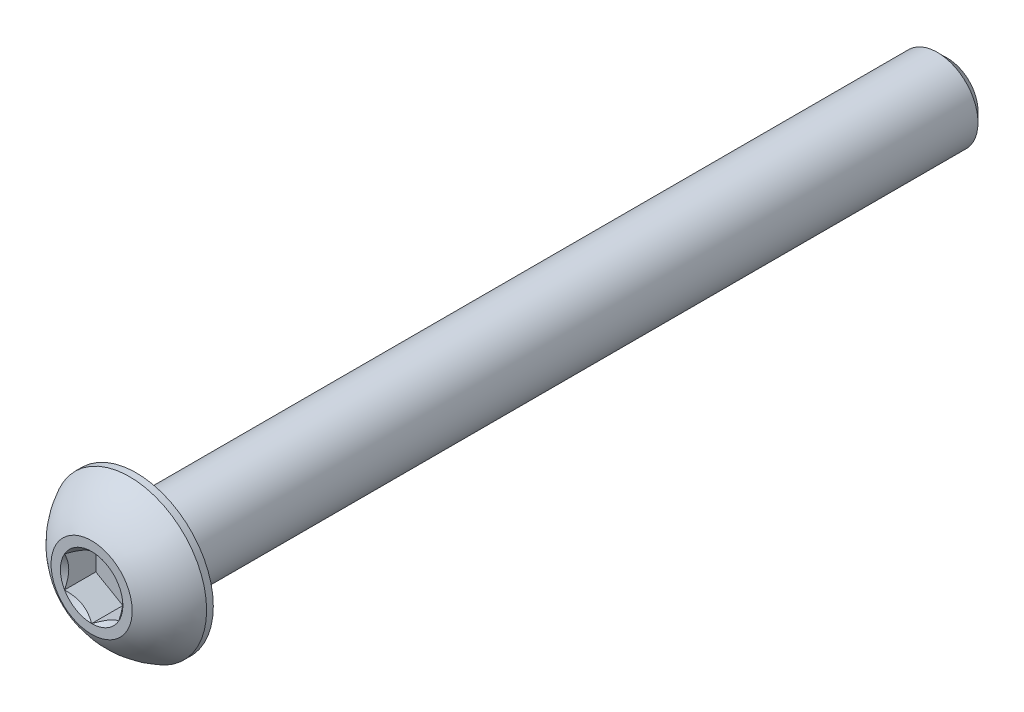
ISO-10303-21;
HEADER;
FILE_DESCRIPTION(('STEP AP214'),'2;1');
FILE_NAME('part.step','',(''),(''),'','','');
FILE_SCHEMA(('AUTOMOTIVE_DESIGN { 1 0 10303 214 1 1 1 1 }'));
ENDSEC;
DATA;
#1=APPLICATION_CONTEXT('core data for automotive mechanical design processes');
#2=APPLICATION_PROTOCOL_DEFINITION('international standard','automotive_design',2000,#1);
#3=PRODUCT_CONTEXT('',#1,'mechanical');
#4=PRODUCT('Part','Part','',(#3));
#5=PRODUCT_RELATED_PRODUCT_CATEGORY('part','',(#4));
#6=PRODUCT_DEFINITION_FORMATION('','',#4);
#7=PRODUCT_DEFINITION_CONTEXT('part definition',#1,'design');
#8=PRODUCT_DEFINITION('design','',#6,#7);
#9=PRODUCT_DEFINITION_SHAPE('','',#8);
#10=(LENGTH_UNIT() NAMED_UNIT(*) SI_UNIT(.MILLI.,.METRE.));
#11=(NAMED_UNIT(*) PLANE_ANGLE_UNIT() SI_UNIT($,.RADIAN.));
#12=(NAMED_UNIT(*) SI_UNIT($,.STERADIAN.) SOLID_ANGLE_UNIT());
#13=UNCERTAINTY_MEASURE_WITH_UNIT(LENGTH_MEASURE(1.E-05),#10,'distance_accuracy_value','');
#14=(GEOMETRIC_REPRESENTATION_CONTEXT(3) GLOBAL_UNCERTAINTY_ASSIGNED_CONTEXT((#13)) GLOBAL_UNIT_ASSIGNED_CONTEXT((#10,
#11,#12)) REPRESENTATION_CONTEXT('',''));
#15=CARTESIAN_POINT('',(0.,0.,0.));
#16=DIRECTION('',(0.,0.,1.));
#17=DIRECTION('',(1.,0.,0.));
#18=AXIS2_PLACEMENT_3D('',#15,#16,#17);
#19=CARTESIAN_POINT('',(0.,0.,-31.65));
#20=DIRECTION('',(0.,0.,1.));
#21=DIRECTION('',(1.,0.,0.));
#22=AXIS2_PLACEMENT_3D('',#19,#20,#21);
#23=PLANE('',#22);
#24=CARTESIAN_POINT('',(0.,0.,-31.65));
#25=DIRECTION('',(0.,0.,1.));
#26=DIRECTION('',(1.,0.,0.));
#27=AXIS2_PLACEMENT_3D('',#24,#25,#26);
#28=CIRCLE('',#27,1.12500000000003);
#29=CARTESIAN_POINT('',(1.12500000000003,0.,-31.65));
#30=VERTEX_POINT('',#29);
#31=EDGE_CURVE('E49',#30,#30,#28,.T.);
#32=ORIENTED_EDGE('',*,*,#31,.F.);
#33=EDGE_LOOP('',(#32));
#34=FACE_BOUND('',#33,.T.);
#35=ADVANCED_FACE('F36',(#34),#23,.F.);
#36=CARTESIAN_POINT('',(0.,0.,-31.65));
#37=DIRECTION('',(0.,0.,1.));
#38=DIRECTION('',(1.,0.,0.));
#39=AXIS2_PLACEMENT_3D('',#36,#37,#38);
#40=CONICAL_SURFACE('',#39,1.12500000000003,0.78539816339743);
#41=CARTESIAN_POINT('',(0.,0.,-31.275));
#42=DIRECTION('',(0.,0.,1.));
#43=DIRECTION('',(1.,0.,0.));
#44=AXIS2_PLACEMENT_3D('',#41,#42,#43);
#45=CIRCLE('',#44,1.50000000000001);
#46=CARTESIAN_POINT('',(1.50000000000001,0.,-31.275));
#47=VERTEX_POINT('',#46);
#48=EDGE_CURVE('E175',#47,#47,#45,.T.);
#49=ORIENTED_EDGE('',*,*,#48,.F.);
#50=EDGE_LOOP('',(#49));
#51=FACE_BOUND('',#50,.T.);
#52=ORIENTED_EDGE('',*,*,#31,.T.);
#53=EDGE_LOOP('',(#52));
#54=FACE_BOUND('',#53,.T.);
#55=ADVANCED_FACE('F180',(#51,#54),#40,.T.);
#56=CARTESIAN_POINT('',(0.,0.,0.));
#57=DIRECTION('',(0.,0.,1.));
#58=DIRECTION('',(1.,0.,0.));
#59=AXIS2_PLACEMENT_3D('',#56,#57,#58);
#60=CYLINDRICAL_SURFACE('',#59,1.50000000000001);
#61=CARTESIAN_POINT('',(0.,0.,-1.65));
#62=DIRECTION('',(0.,0.,1.));
#63=DIRECTION('',(1.,0.,0.));
#64=AXIS2_PLACEMENT_3D('',#61,#62,#63);
#65=CIRCLE('',#64,1.50000000000002);
#66=CARTESIAN_POINT('',(1.50000000000002,0.,-1.65));
#67=VERTEX_POINT('',#66);
#68=EDGE_CURVE('E172',#67,#67,#65,.T.);
#69=ORIENTED_EDGE('',*,*,#68,.F.);
#70=EDGE_LOOP('',(#69));
#71=FACE_BOUND('',#70,.T.);
#72=ORIENTED_EDGE('',*,*,#48,.T.);
#73=EDGE_LOOP('',(#72));
#74=FACE_BOUND('',#73,.T.);
#75=ADVANCED_FACE('F186',(#71,#74),#60,.T.);
#76=CARTESIAN_POINT('',(0.,-2.85,-1.65));
#77=DIRECTION('',(0.,0.,1.));
#78=DIRECTION('',(1.,0.,0.));
#79=AXIS2_PLACEMENT_3D('',#76,#77,#78);
#80=PLANE('',#79);
#81=CARTESIAN_POINT('',(0.,0.,-1.65));
#82=DIRECTION('',(0.,0.,1.));
#83=DIRECTION('',(1.,0.,0.));
#84=AXIS2_PLACEMENT_3D('',#81,#82,#83);
#85=CIRCLE('',#84,2.85);
#86=CARTESIAN_POINT('',(2.85,0.,-1.65));
#87=VERTEX_POINT('',#86);
#88=EDGE_CURVE('E166',#87,#87,#85,.T.);
#89=ORIENTED_EDGE('',*,*,#88,.F.);
#90=EDGE_LOOP('',(#89));
#91=FACE_BOUND('',#90,.T.);
#92=ORIENTED_EDGE('',*,*,#68,.T.);
#93=EDGE_LOOP('',(#92));
#94=FACE_BOUND('',#93,.T.);
#95=ADVANCED_FACE('F191',(#91,#94),#80,.F.);
#96=CARTESIAN_POINT('',(0.,0.,-2.79483288770053));
#97=DIRECTION('',(0.,0.,1.));
#98=DIRECTION('',(0.,-1.,0.));
#99=AXIS2_PLACEMENT_3D('',#96,#97,#98);
#100=SPHERICAL_SURFACE('',#99,3.17192226735975);
#101=CARTESIAN_POINT('',(0.,0.,0.));
#102=DIRECTION('',(0.,0.,1.));
#103=DIRECTION('',(1.,0.,0.));
#104=AXIS2_PLACEMENT_3D('',#101,#102,#103);
#105=CIRCLE('',#104,1.50000000000002);
#106=CARTESIAN_POINT('',(0.,-1.50000000000002,0.));
#107=VERTEX_POINT('',#106);
#108=EDGE_CURVE('E169',#107,#107,#105,.T.);
#109=CARTESIAN_POINT('',(0.,0.,-1.4025));
#110=DIRECTION('',(0.,0.,1.));
#111=DIRECTION('',(1.,0.,0.));
#112=AXIS2_PLACEMENT_3D('',#109,#110,#111);
#113=CIRCLE('',#112,2.85);
#114=CARTESIAN_POINT('',(0.,-2.85,-1.4025));
#115=VERTEX_POINT('',#114);
#116=EDGE_CURVE('E163',#115,#115,#113,.T.);
#117=CARTESIAN_POINT('',(0.,-1.50000000000002,0.));
#118=CARTESIAN_POINT('',(0.,-1.51816007989212,-0.009746569473365));
#119=CARTESIAN_POINT('',(0.,-1.53622513742982,-0.0196701847238474));
#120=CARTESIAN_POINT('',(0.,-1.57215840256596,-0.039867631129312));
#121=CARTESIAN_POINT('',(0.,-1.59002661016439,-0.0501414622842942));
#122=CARTESIAN_POINT('',(0.,-1.62555937019151,-0.0710354648490238));
#123=CARTESIAN_POINT('',(0.,-1.64322392262021,-0.0816556362587711));
#124=CARTESIAN_POINT('',(0.,-1.67834266450263,-0.103238276426968));
#125=CARTESIAN_POINT('',(0.,-1.69579685395637,-0.114200745185417));
#126=CARTESIAN_POINT('',(0.,-1.73048823664555,-0.136463816635607));
#127=CARTESIAN_POINT('',(0.,-1.747725429881,-0.147764419327348));
#128=CARTESIAN_POINT('',(0.,-1.78197627078177,-0.170699464187154));
#129=CARTESIAN_POINT('',(0.,-1.7989899184471,-0.18233390635522));
#130=CARTESIAN_POINT('',(0.,-1.83278720341136,-0.205932209546913));
#131=CARTESIAN_POINT('',(0.,-1.84957084071029,-0.217896070570541));
#132=CARTESIAN_POINT('',(0.,-1.88290172764637,-0.242148665498755));
#133=CARTESIAN_POINT('',(0.,-1.89944897728351,-0.254437399403342));
#134=CARTESIAN_POINT('',(0.,-1.9323008013937,-0.279335070725424));
#135=CARTESIAN_POINT('',(0.,-1.94860537586674,-0.291944008142921));
#136=CARTESIAN_POINT('',(0.,-1.98096565436366,-0.317477295441113));
#137=CARTESIAN_POINT('',(0.,-1.99702135838754,-0.330401645321808));
#138=CARTESIAN_POINT('',(0.,-2.02887779526297,-0.356560846652227));
#139=CARTESIAN_POINT('',(0.,-2.04467852811453,-0.36979569810195));
#140=CARTESIAN_POINT('',(0.,-2.07601901880465,-0.396570873693308));
#141=CARTESIAN_POINT('',(0.,-2.09155877664322,-0.410111197834944));
#142=CARTESIAN_POINT('',(0.,-2.12237141262986,-0.437492173862107));
#143=CARTESIAN_POINT('',(0.,-2.13764429077792,-0.451332825747635));
#144=CARTESIAN_POINT('',(0.,-2.16791736411296,-0.479309198198269));
#145=CARTESIAN_POINT('',(0.,-2.18291755929994,-0.493444918763376));
#146=CARTESIAN_POINT('',(0.,-2.21263956705415,-0.522006057390952));
#147=CARTESIAN_POINT('',(0.,-2.2273613796214,-0.53643147545342));
#148=CARTESIAN_POINT('',(0.,-2.25652102825521,-0.565566527816472));
#149=CARTESIAN_POINT('',(0.,-2.27095886432178,-0.580276162117056));
#150=CARTESIAN_POINT('',(0.,-2.2995450739765,-0.609974057702796));
#151=CARTESIAN_POINT('',(0.,-2.31369344756466,-0.624962318987953));
#152=CARTESIAN_POINT('',(0.,-2.34169535627252,-0.65521177341876));
#153=CARTESIAN_POINT('',(0.,-2.35554889139224,-0.670472966564411));
#154=CARTESIAN_POINT('',(0.,-2.38295585920366,-0.701262485885584));
#155=CARTESIAN_POINT('',(0.,-2.39650929189537,-0.716790812061106));
#156=CARTESIAN_POINT('',(0.,-2.42331090492182,-0.748108697108243));
#157=CARTESIAN_POINT('',(0.,-2.43655908525657,-0.763898255979859));
#158=CARTESIAN_POINT('',(0.,-2.46274515962755,-0.795732606824228));
#159=CARTESIAN_POINT('',(0.,-2.47568305366379,-0.811777398796981));
#160=CARTESIAN_POINT('',(0.,-2.50124363939651,-0.844116119267127));
#161=CARTESIAN_POINT('',(0.,-2.51386633109298,-0.86041004776452));
#162=CARTESIAN_POINT('',(0.,-2.53879171587279,-0.8932408500426));
#163=CARTESIAN_POINT('',(0.,-2.55109440895612,-0.909777723823287));
#164=CARTESIAN_POINT('',(0.,-2.57537512182785,-0.94308813311364));
#165=CARTESIAN_POINT('',(0.,-2.58735314161625,-0.959861668623306));
#166=CARTESIAN_POINT('',(0.,-2.61097995657956,-0.993639027894247));
#167=CARTESIAN_POINT('',(0.,-2.62262875175448,-1.01064285165552));
#168=CARTESIAN_POINT('',(0.,-2.64559269128199,-1.04487432644225));
#169=CARTESIAN_POINT('',(0.,-2.65690783563458,-1.06210197746771));
#170=CARTESIAN_POINT('',(0.,-2.67920017403639,-1.09677456077299));
#171=CARTESIAN_POINT('',(0.,-2.69017736808561,-1.11421949305282));
#172=CARTESIAN_POINT('',(0.,-2.711789634999,-1.14932001019995));
#173=CARTESIAN_POINT('',(0.,-2.72242470786316,-1.16697559506725));
#174=CARTESIAN_POINT('',(0.,-2.74334869082118,-1.20249070903943));
#175=CARTESIAN_POINT('',(0.,-2.75363760091502,-1.22035023814429));
#176=CARTESIAN_POINT('',(0.,-2.77386535089241,-1.25626645340824));
#177=CARTESIAN_POINT('',(0.,-2.78380419077596,-1.27432313956732));
#178=CARTESIAN_POINT('',(0.,-2.80332801615778,-1.31062681184411));
#179=CARTESIAN_POINT('',(0.,-2.81291300165605,-1.32887379796182));
#180=CARTESIAN_POINT('',(0.,-2.83172550494215,-1.3655511220839));
#181=CARTESIAN_POINT('',(0.,-2.84095302272998,-1.38398146008827));
#182=CARTESIAN_POINT('',(0.,-2.85,-1.4025));
#183=B_SPLINE_CURVE_WITH_KNOTS('',3,(#117,#118,#119,#120,#121,#122,#123,#124,#125,#126,#127,
#128,#129,#130,#131,#132,#133,#134,#135,#136,#137,#138,#139,#140,#141,#142,#143,#144,#145,#146,
#147,#148,#149,#150,#151,#152,#153,#154,#155,#156,#157,#158,#159,#160,#161,#162,#163,#164,#165,
#166,#167,#168,#169,#170,#171,#172,#173,#174,#175,#176,#177,#178,#179,#180,#181,#182),
.UNSPECIFIED.,.F.,.F.,(4,2,2,2,2,2,2,2,2,2,2,2,2,2,2,2,2,2,2,2,2,2,2,2,2,2,2,2,2,2,2,2,4),(0.,
0.061829894182698,0.123659788365395,0.185489682548094,0.247319576730792,0.30914947091349,
0.370979365096188,0.432809259278885,0.494639153461583,0.556469047644282,0.618298941826979,
0.680128836009677,0.741958730192375,0.803788624375073,0.865618518557771,0.927448412740469,
0.989278306923166,1.05110820110586,1.11293809528856,1.17476798947126,1.23659788365396,
1.29842777783666,1.36025767201935,1.42208756620205,1.48391746038475,1.54574735456745,
1.60757724875015,1.66940714293284,1.73123703711554,1.79306693129824,1.85489682548094,
1.91672671966364,1.97855661384633),.UNSPECIFIED.);
#184=EDGE_CURVE('BSEAM196',#107,#115,#183,.T.);
#185=ORIENTED_EDGE('',*,*,#108,.F.);
#186=ORIENTED_EDGE('',*,*,#116,.T.);
#187=ORIENTED_EDGE('',*,*,#184,.T.);
#188=ORIENTED_EDGE('',*,*,#184,.F.);
#189=EDGE_LOOP('',(#185,#187,#186,#188));
#190=FACE_BOUND('',#189,.T.);
#191=ADVANCED_FACE('F196',(#190),#100,.T.);
#192=CARTESIAN_POINT('',(0.,-1.50000000000002,0.));
#193=DIRECTION('',(0.,0.,-1.));
#194=DIRECTION('',(-1.,0.,0.));
#195=AXIS2_PLACEMENT_3D('',#192,#193,#194);
#196=PLANE('',#195);
#197=CARTESIAN_POINT('',(0.,0.,0.));
#198=DIRECTION('',(0.,0.,1.));
#199=DIRECTION('',(1.,0.,0.));
#200=AXIS2_PLACEMENT_3D('',#197,#198,#199);
#201=CIRCLE('',#200,1.15470053837925);
#202=CARTESIAN_POINT('',(-0.999999999999997,0.577350269189625,0.));
#203=VERTEX_POINT('',#202);
#204=CARTESIAN_POINT('',(-0.999999999999997,-0.577350269189627,0.));
#205=VERTEX_POINT('',#204);
#206=EDGE_CURVE('E62',#203,#205,#201,.T.);
#207=ORIENTED_EDGE('',*,*,#206,.F.);
#208=CARTESIAN_POINT('',(0.,1.15470053837925,0.));
#209=VERTEX_POINT('',#208);
#210=EDGE_CURVE('E134',#209,#203,#201,.T.);
#211=ORIENTED_EDGE('',*,*,#210,.F.);
#212=CARTESIAN_POINT('',(1.,0.57735026918962,0.));
#213=VERTEX_POINT('',#212);
#214=EDGE_CURVE('E131',#213,#209,#201,.T.);
#215=ORIENTED_EDGE('',*,*,#214,.F.);
#216=CARTESIAN_POINT('',(1.,-0.577350269189621,0.));
#217=VERTEX_POINT('',#216);
#218=EDGE_CURVE('E102',#217,#213,#201,.T.);
#219=ORIENTED_EDGE('',*,*,#218,.F.);
#220=CARTESIAN_POINT('',(0.,-1.15470053837925,0.));
#221=VERTEX_POINT('',#220);
#222=EDGE_CURVE('E94',#221,#217,#201,.T.);
#223=ORIENTED_EDGE('',*,*,#222,.F.);
#224=EDGE_CURVE('E55',#205,#221,#201,.T.);
#225=ORIENTED_EDGE('',*,*,#224,.F.);
#226=EDGE_LOOP('',(#207,#211,#215,#219,#223,#225));
#227=FACE_BOUND('',#226,.T.);
#228=ORIENTED_EDGE('',*,*,#108,.T.);
#229=EDGE_LOOP('',(#228));
#230=FACE_BOUND('',#229,.T.);
#231=ADVANCED_FACE('F128',(#227,#230),#196,.F.);
#232=CARTESIAN_POINT('',(0.,0.,0.));
#233=DIRECTION('',(0.,0.,1.));
#234=DIRECTION('',(1.,0.,0.));
#235=AXIS2_PLACEMENT_3D('',#232,#233,#234);
#236=CYLINDRICAL_SURFACE('',#235,2.85);
#237=ORIENTED_EDGE('',*,*,#116,.F.);
#238=EDGE_LOOP('',(#237));
#239=FACE_BOUND('',#238,.T.);
#240=ORIENTED_EDGE('',*,*,#88,.T.);
#241=EDGE_LOOP('',(#240));
#242=FACE_BOUND('',#241,.T.);
#243=ADVANCED_FACE('F202',(#239,#242),#236,.T.);
#244=CARTESIAN_POINT('',(0.,0.,0.));
#245=DIRECTION('',(0.,0.,1.));
#246=DIRECTION('',(1.,0.,0.));
#247=AXIS2_PLACEMENT_3D('',#244,#245,#246);
#248=CONICAL_SURFACE('',#247,1.15470053837925,0.78539816339745);
#249=ORIENTED_EDGE('',*,*,#218,.T.);
#250=CARTESIAN_POINT('',(1.,-1.15147208646461,0.370385677513857));
#251=CARTESIAN_POINT('',(1.,-1.12343447988551,0.349219919873708));
#252=CARTESIAN_POINT('',(1.,-1.09524064850696,0.328261692175906));
#253=CARTESIAN_POINT('',(1.,-1.03847715644375,0.286846022235618));
#254=CARTESIAN_POINT('',(1.,-1.00990740382974,0.266388706123655));
#255=CARTESIAN_POINT('',(1.,-0.92312089433347,0.205604794954506));
#256=CARTESIAN_POINT('',(1.,-0.864253173759053,0.166192228961395));
#257=CARTESIAN_POINT('',(1.,-0.74080985825804,0.0888206642002037));
#258=CARTESIAN_POINT('',(1.,-0.676100255137802,0.0510730391143415));
#259=CARTESIAN_POINT('',(1.,-0.54344893904912,-0.0179754124487081));
#260=CARTESIAN_POINT('',(1.,-0.475519112027775,-0.049297972153134));
#261=CARTESIAN_POINT('',(1.,-0.373555850333526,-0.0876182211162039));
#262=CARTESIAN_POINT('',(1.,-0.341031989670905,-0.0986164083578424));
#263=CARTESIAN_POINT('',(1.,-0.275199079052291,-0.118001657852638));
#264=CARTESIAN_POINT('',(1.,-0.24188997517393,-0.126388540223299));
#265=CARTESIAN_POINT('',(1.,-0.17524751704299,-0.139974779280982));
#266=CARTESIAN_POINT('',(1.,-0.141925568218173,-0.145229209232031));
#267=CARTESIAN_POINT('',(1.,-0.0749144362322771,-0.152451313429106));
#268=CARTESIAN_POINT('',(1.,-0.0412251978501601,-0.15441848638949));
#269=CARTESIAN_POINT('',(1.,0.0249580992634224,-0.154916801606837));
#270=CARTESIAN_POINT('',(1.,0.0574512826460405,-0.153569732111363));
#271=CARTESIAN_POINT('',(1.,0.122148505701868,-0.147783515501013));
#272=CARTESIAN_POINT('',(1.,0.154352610132927,-0.143345079338462));
#273=CARTESIAN_POINT('',(1.,0.21879989886764,-0.131543169854794));
#274=CARTESIAN_POINT('',(1.,0.251033743268954,-0.124129458961488));
#275=CARTESIAN_POINT('',(1.,0.314797132354919,-0.106771057501322));
#276=CARTESIAN_POINT('',(1.,0.346326735731005,-0.0968265787111677));
#277=CARTESIAN_POINT('',(1.,0.445594187730205,-0.0617765174456608));
#278=CARTESIAN_POINT('',(1.,0.511919139476036,-0.0326791416432731));
#279=CARTESIAN_POINT('',(1.,0.641453244657532,0.0320153296865072));
#280=CARTESIAN_POINT('',(1.,0.704650133126345,0.0676357767152442));
#281=CARTESIAN_POINT('',(1.,0.825428490174987,0.141123901346938));
#282=CARTESIAN_POINT('',(1.,0.883132947867685,0.178791947135466));
#283=CARTESIAN_POINT('',(1.,0.968148853704565,0.237022852943166));
#284=CARTESIAN_POINT('',(1.,0.996120570380285,0.256638475762859));
#285=CARTESIAN_POINT('',(1.,1.05168177729901,0.296388517061273));
#286=CARTESIAN_POINT('',(1.,1.079271369977,0.316522792198834));
#287=CARTESIAN_POINT('',(1.,1.10670185346329,0.336872119072974));
#288=B_SPLINE_CURVE_WITH_KNOTS('',3,(#250,#251,#252,#253,#254,#255,#256,#257,#258,#259,#260,
#261,#262,#263,#264,#265,#266,#267,#268,#269,#270,#271,#272,#273,#274,#275,#276,#277,#278,#279,
#280,#281,#282,#283,#284,#285,#286,#287),.UNSPECIFIED.,.F.,.F.,(4,2,2,2,2,2,2,2,2,2,2,2,2,2,2,2,
2,2,4),(0.,0.10538645908329,0.210799187330123,0.423233611565466,0.647793540908498,
0.871580877738603,0.974493074181413,1.077412358272,1.17846428203204,1.27953161415761,
1.37694086739609,1.47432772585407,1.57343322804292,1.6725304397285,1.88917353996826,
2.10660791038812,2.31323734249842,2.41572589232043,2.51818641476502),.UNSPECIFIED.);
#289=EDGE_CURVE('E11',#217,#213,#288,.T.);
#290=ORIENTED_EDGE('',*,*,#289,.F.);
#291=EDGE_LOOP('',(#249,#290));
#292=FACE_BOUND('',#291,.T.);
#293=ADVANCED_FACE('F106',(#292),#248,.F.);
#294=ORIENTED_EDGE('',*,*,#214,.T.);
#295=CARTESIAN_POINT('',(1.0002,0.577234799135786,0.000115487372616175));
#296=CARTESIAN_POINT('',(0.96581740499282,0.59708559961862,-0.0197220691742649));
#297=CARTESIAN_POINT('',(0.930859881860175,0.617268335009455,-0.0383949793611092));
#298=CARTESIAN_POINT('',(0.85957719704391,0.658423412276684,-0.0725852572768405));
#299=CARTESIAN_POINT('',(0.823245249471016,0.679399671988078,-0.0880835909765399));
#300=CARTESIAN_POINT('',(0.749983386196688,0.721697428470845,-0.114632692857734));
#301=CARTESIAN_POINT('',(0.713072148554585,0.743008141459635,-0.125750226003073));
#302=CARTESIAN_POINT('',(0.63843727068914,0.786098608286185,-0.142880134223817));
#303=CARTESIAN_POINT('',(0.600715911891363,0.80787704494228,-0.148905302533326));
#304=CARTESIAN_POINT('',(0.535707801582065,0.845409494928862,-0.154339445032505));
#305=CARTESIAN_POINT('',(0.508505628471827,0.8611146768966,-0.155143061683267));
#306=CARTESIAN_POINT('',(0.454153959330887,0.892494627706028,-0.153793300583112));
#307=CARTESIAN_POINT('',(0.427004476245123,0.908169389073952,-0.1516392704528));
#308=CARTESIAN_POINT('',(0.345943722673039,0.954969836969509,-0.140883027871528));
#309=CARTESIAN_POINT('',(0.292435859021572,0.985862616452446,-0.127985443584643));
#310=CARTESIAN_POINT('',(0.198523934856568,1.04008269114923,-0.0968592693978221));
#311=CARTESIAN_POINT('',(0.157679476328165,1.0636642502755,-0.0802622022981601));
#312=CARTESIAN_POINT('',(0.0775903626180563,1.10990372163519,-0.042875075314707));
#313=CARTESIAN_POINT('',(0.0383409891295625,1.1325643579843,-0.0220986581825966));
#314=CARTESIAN_POINT('',(-0.000199999999999514,1.15481600843309,0.000115487372613833));
#315=B_SPLINE_CURVE_WITH_KNOTS('',3,(#295,#296,#297,#298,#299,#300,#301,#302,#303,#304,#305,
#306,#307,#308,#309,#310,#311,#312,#313,#314),.UNSPECIFIED.,.F.,.F.,(4,2,2,2,2,2,2,2,2,4),(0.,
0.13323767682856,0.267252229834491,0.399137076269302,0.53068960328077,0.624814864263848,
0.718960890149135,0.907306626112099,1.05710100361789,1.20641411519286),.UNSPECIFIED.);
#316=EDGE_CURVE('E133',#213,#209,#315,.T.);
#317=ORIENTED_EDGE('',*,*,#316,.F.);
#318=EDGE_LOOP('',(#294,#317));
#319=FACE_BOUND('',#318,.T.);
#320=ADVANCED_FACE('F289',(#319),#248,.F.);
#321=ORIENTED_EDGE('',*,*,#210,.T.);
#322=CARTESIAN_POINT('',(0.000200000000000433,1.15481600843309,0.000115487372613877));
#323=CARTESIAN_POINT('',(-0.0341825950071802,1.13496520795025,-0.019722069174267));
#324=CARTESIAN_POINT('',(-0.0691401181398243,1.11478247255942,-0.0383949793611112));
#325=CARTESIAN_POINT('',(-0.140422802956089,1.07362739529219,-0.0725852572768422));
#326=CARTESIAN_POINT('',(-0.176754750528983,1.0526511355808,-0.0880835909765415));
#327=CARTESIAN_POINT('',(-0.25001661380331,1.01035337909803,-0.114632692857735));
#328=CARTESIAN_POINT('',(-0.286927851445413,0.989042666109238,-0.125750226003074));
#329=CARTESIAN_POINT('',(-0.361562729310858,0.945952199282689,-0.142880134223818));
#330=CARTESIAN_POINT('',(-0.399284088108635,0.924173762626594,-0.148905302533327));
#331=CARTESIAN_POINT('',(-0.464292198417932,0.886641312640012,-0.154339445032506));
#332=CARTESIAN_POINT('',(-0.491494371528171,0.870936130672273,-0.155143061683268));
#333=CARTESIAN_POINT('',(-0.54584604066911,0.839556179862846,-0.153793300583113));
#334=CARTESIAN_POINT('',(-0.572995523754874,0.823881418494921,-0.151639270452801));
#335=CARTESIAN_POINT('',(-0.654056277326958,0.777080970599365,-0.140883027871529));
#336=CARTESIAN_POINT('',(-0.707564140978425,0.746188191116428,-0.127985443584644));
#337=CARTESIAN_POINT('',(-0.801476065143429,0.691968116419648,-0.096859269397823));
#338=CARTESIAN_POINT('',(-0.842320523671832,0.66838655729337,-0.080262202298161));
#339=CARTESIAN_POINT('',(-0.922409637381941,0.62214708593368,-0.0428750753147078));
#340=CARTESIAN_POINT('',(-0.961659010870435,0.599486449584574,-0.0220986581825973));
#341=CARTESIAN_POINT('',(-1.0002,0.577234799135787,0.00011548737261326));
#342=B_SPLINE_CURVE_WITH_KNOTS('',3,(#322,#323,#324,#325,#326,#327,#328,#329,#330,#331,#332,
#333,#334,#335,#336,#337,#338,#339,#340,#341),.UNSPECIFIED.,.F.,.F.,(4,2,2,2,2,2,2,2,2,4),(0.,
0.133237676828559,0.26725222983449,0.399137076269299,0.530689603280767,0.624814864263845,
0.718960890149132,0.907306626112096,1.05710100361789,1.20641411519286),.UNSPECIFIED.);
#343=EDGE_CURVE('E138',#209,#203,#342,.T.);
#344=ORIENTED_EDGE('',*,*,#343,.F.);
#345=EDGE_LOOP('',(#321,#344));
#346=FACE_BOUND('',#345,.T.);
#347=ADVANCED_FACE('F141',(#346),#248,.F.);
#348=ORIENTED_EDGE('',*,*,#206,.T.);
#349=CARTESIAN_POINT('',(-0.999999999999996,-1.15147208646461,0.370385677513859));
#350=CARTESIAN_POINT('',(-0.999999999999996,-1.12343447988552,0.34921991987371));
#351=CARTESIAN_POINT('',(-0.999999999999996,-1.09524064850697,0.328261692175907));
#352=CARTESIAN_POINT('',(-0.999999999999996,-1.03847715644376,0.286846022235619));
#353=CARTESIAN_POINT('',(-0.999999999999996,-1.00990740382975,0.266388706123656));
#354=CARTESIAN_POINT('',(-0.999999999999996,-0.923120894333474,0.205604794954507));
#355=CARTESIAN_POINT('',(-0.999999999999997,-0.864253173759057,0.166192228961396));
#356=CARTESIAN_POINT('',(-0.999999999999997,-0.740809858258044,0.0888206642002033));
#357=CARTESIAN_POINT('',(-0.999999999999997,-0.676100255137805,0.0510730391143406));
#358=CARTESIAN_POINT('',(-0.999999999999997,-0.543448939049123,-0.0179754124487097));
#359=CARTESIAN_POINT('',(-0.999999999999997,-0.475519112027777,-0.049297972153136));
#360=CARTESIAN_POINT('',(-0.999999999999997,-0.373555850333528,-0.0876182211162064));
#361=CARTESIAN_POINT('',(-0.999999999999997,-0.341031989670907,-0.098616408357845));
#362=CARTESIAN_POINT('',(-0.999999999999997,-0.275199079052293,-0.118001657852641));
#363=CARTESIAN_POINT('',(-0.999999999999997,-0.241889975173932,-0.126388540223302));
#364=CARTESIAN_POINT('',(-0.999999999999997,-0.175247517042992,-0.139974779280985));
#365=CARTESIAN_POINT('',(-0.999999999999997,-0.141925568218175,-0.145229209232034));
#366=CARTESIAN_POINT('',(-0.999999999999997,-0.0749144362322791,-0.152451313429109));
#367=CARTESIAN_POINT('',(-0.999999999999997,-0.041225197850162,-0.154418486389493));
#368=CARTESIAN_POINT('',(-0.999999999999997,0.0249580992634205,-0.15491680160684));
#369=CARTESIAN_POINT('',(-0.999999999999997,0.0574512826460387,-0.153569732111367));
#370=CARTESIAN_POINT('',(-0.999999999999997,0.122148505701866,-0.147783515501016));
#371=CARTESIAN_POINT('',(-0.999999999999997,0.154352610132926,-0.143345079338466));
#372=CARTESIAN_POINT('',(-0.999999999999997,0.218799898867639,-0.131543169854798));
#373=CARTESIAN_POINT('',(-0.999999999999997,0.251033743268952,-0.124129458961492));
#374=CARTESIAN_POINT('',(-0.999999999999997,0.314797132354917,-0.106771057501326));
#375=CARTESIAN_POINT('',(-0.999999999999997,0.346326735731003,-0.0968265787111716));
#376=CARTESIAN_POINT('',(-0.999999999999997,0.445594187730203,-0.0617765174456648));
#377=CARTESIAN_POINT('',(-0.999999999999997,0.511919139476034,-0.0326791416432772));
#378=CARTESIAN_POINT('',(-0.999999999999997,0.641453244657529,0.0320153296865026));
#379=CARTESIAN_POINT('',(-0.999999999999997,0.704650133126341,0.0676357767152392));
#380=CARTESIAN_POINT('',(-0.999999999999997,0.825428490174983,0.141123901346932));
#381=CARTESIAN_POINT('',(-0.999999999999997,0.883132947867681,0.17879194713546));
#382=CARTESIAN_POINT('',(-0.999999999999997,0.968148853704561,0.23702285294316));
#383=CARTESIAN_POINT('',(-0.999999999999997,0.99612057038028,0.256638475762853));
#384=CARTESIAN_POINT('',(-0.999999999999997,1.05168177729901,0.296388517061267));
#385=CARTESIAN_POINT('',(-0.999999999999997,1.079271369977,0.316522792198828));
#386=CARTESIAN_POINT('',(-0.999999999999997,1.10670185346329,0.336872119072968));
#387=B_SPLINE_CURVE_WITH_KNOTS('',3,(#349,#350,#351,#352,#353,#354,#355,#356,#357,#358,#359,
#360,#361,#362,#363,#364,#365,#366,#367,#368,#369,#370,#371,#372,#373,#374,#375,#376,#377,#378,
#379,#380,#381,#382,#383,#384,#385,#386),.UNSPECIFIED.,.F.,.F.,(4,2,2,2,2,2,2,2,2,2,2,2,2,2,2,2,
2,2,4),(0.,0.10538645908329,0.210799187330124,0.423233611565468,0.647793540908502,
0.871580877738608,0.974493074181418,1.07741235827201,1.17846428203204,1.27953161415762,
1.3769408673961,1.47432772585407,1.57343322804293,1.67253043972851,1.88917353996827,
2.10660791038812,2.31323734249843,2.41572589232044,2.51818641476502),.UNSPECIFIED.);
#388=EDGE_CURVE('E145',#203,#205,#387,.F.);
#389=ORIENTED_EDGE('',*,*,#388,.F.);
#390=EDGE_LOOP('',(#348,#389));
#391=FACE_BOUND('',#390,.T.);
#392=ADVANCED_FACE('F283',(#391),#248,.F.);
#393=ORIENTED_EDGE('',*,*,#224,.T.);
#394=CARTESIAN_POINT('',(-1.0002,-0.577234799135786,0.000115487372612706));
#395=CARTESIAN_POINT('',(-0.965817404992816,-0.59708559961862,-0.0197220691742684));
#396=CARTESIAN_POINT('',(-0.930859881860172,-0.617268335009454,-0.0383949793611125));
#397=CARTESIAN_POINT('',(-0.859577197043907,-0.658423412276684,-0.0725852572768433));
#398=CARTESIAN_POINT('',(-0.823245249471013,-0.679399671988078,-0.0880835909765424));
#399=CARTESIAN_POINT('',(-0.749983386196686,-0.721697428470844,-0.114632692857736));
#400=CARTESIAN_POINT('',(-0.713072148554583,-0.743008141459635,-0.125750226003075));
#401=CARTESIAN_POINT('',(-0.638437270689138,-0.786098608286184,-0.142880134223819));
#402=CARTESIAN_POINT('',(-0.600715911891361,-0.807877044942279,-0.148905302533328));
#403=CARTESIAN_POINT('',(-0.535707801582064,-0.84540949492886,-0.154339445032507));
#404=CARTESIAN_POINT('',(-0.508505628471825,-0.861114676896599,-0.155143061683269));
#405=CARTESIAN_POINT('',(-0.454153959330885,-0.892494627706026,-0.153793300583114));
#406=CARTESIAN_POINT('',(-0.427004476245122,-0.908169389073951,-0.151639270452802));
#407=CARTESIAN_POINT('',(-0.345943722673037,-0.954969836969508,-0.14088302787153));
#408=CARTESIAN_POINT('',(-0.29243585902157,-0.985862616452444,-0.127985443584645));
#409=CARTESIAN_POINT('',(-0.198523934856567,-1.04008269114922,-0.0968592693978238));
#410=CARTESIAN_POINT('',(-0.157679476328164,-1.0636642502755,-0.0802622022981617));
#411=CARTESIAN_POINT('',(-0.0775903626180547,-1.10990372163519,-0.0428750753147082));
#412=CARTESIAN_POINT('',(-0.0383409891295607,-1.1325643579843,-0.0220986581825977));
#413=CARTESIAN_POINT('',(0.000200000000001427,-1.15481600843309,0.000115487372612954));
#414=B_SPLINE_CURVE_WITH_KNOTS('',3,(#394,#395,#396,#397,#398,#399,#400,#401,#402,#403,#404,
#405,#406,#407,#408,#409,#410,#411,#412,#413),.UNSPECIFIED.,.F.,.F.,(4,2,2,2,2,2,2,2,2,4),(0.,
0.133237676828559,0.26725222983449,0.399137076269299,0.530689603280767,0.624814864263845,
0.718960890149132,0.907306626112096,1.05710100361789,1.20641411519286),.UNSPECIFIED.);
#415=EDGE_CURVE('E118',#205,#221,#414,.T.);
#416=ORIENTED_EDGE('',*,*,#415,.F.);
#417=EDGE_LOOP('',(#393,#416));
#418=FACE_BOUND('',#417,.T.);
#419=ADVANCED_FACE('F231',(#418),#248,.F.);
#420=ORIENTED_EDGE('',*,*,#222,.T.);
#421=CARTESIAN_POINT('',(-0.000199999999998591,-1.15481600843309,0.00011548737261301));
#422=CARTESIAN_POINT('',(0.0341825950071819,-1.13496520795025,-0.0197220691742678));
#423=CARTESIAN_POINT('',(0.0691401181398259,-1.11478247255942,-0.0383949793611118));
#424=CARTESIAN_POINT('',(0.14042280295609,-1.07362739529219,-0.0725852572768426));
#425=CARTESIAN_POINT('',(0.176754750528985,-1.05265113558079,-0.0880835909765418));
#426=CARTESIAN_POINT('',(0.250016613803312,-1.01035337909803,-0.114632692857735));
#427=CARTESIAN_POINT('',(0.286927851445415,-0.989042666109238,-0.125750226003074));
#428=CARTESIAN_POINT('',(0.361562729310859,-0.945952199282688,-0.142880134223818));
#429=CARTESIAN_POINT('',(0.399284088108636,-0.924173762626594,-0.148905302533327));
#430=CARTESIAN_POINT('',(0.464292198417933,-0.886641312640012,-0.154339445032506));
#431=CARTESIAN_POINT('',(0.491494371528172,-0.870936130672273,-0.155143061683268));
#432=CARTESIAN_POINT('',(0.545846040669111,-0.839556179862846,-0.153793300583113));
#433=CARTESIAN_POINT('',(0.572995523754875,-0.823881418494921,-0.151639270452801));
#434=CARTESIAN_POINT('',(0.654056277326959,-0.777080970599364,-0.140883027871529));
#435=CARTESIAN_POINT('',(0.707564140978426,-0.746188191116428,-0.127985443584645));
#436=CARTESIAN_POINT('',(0.801476065143431,-0.691968116419647,-0.0968592693978229));
#437=CARTESIAN_POINT('',(0.842320523671833,-0.668386557293369,-0.0802622022981606));
#438=CARTESIAN_POINT('',(0.922409637381943,-0.622147085933678,-0.0428750753147068));
#439=CARTESIAN_POINT('',(0.961659010870437,-0.599486449584572,-0.022098658182596));
#440=CARTESIAN_POINT('',(1.0002,-0.577234799135784,0.00011548737261471));
#441=B_SPLINE_CURVE_WITH_KNOTS('',3,(#421,#422,#423,#424,#425,#426,#427,#428,#429,#430,#431,
#432,#433,#434,#435,#436,#437,#438,#439,#440),.UNSPECIFIED.,.F.,.F.,(4,2,2,2,2,2,2,2,2,4),(0.,
0.133237676828559,0.267252229834489,0.399137076269299,0.530689603280766,0.624814864263844,
0.71896089014913,0.907306626112094,1.05710100361789,1.20641411519286),.UNSPECIFIED.);
#442=EDGE_CURVE('E98',#221,#217,#441,.T.);
#443=ORIENTED_EDGE('',*,*,#442,.F.);
#444=EDGE_LOOP('',(#420,#443));
#445=FACE_BOUND('',#444,.T.);
#446=ADVANCED_FACE('F96',(#445),#248,.F.);
#447=CARTESIAN_POINT('',(1.,-0.577350269189622,-1.155));
#448=DIRECTION('',(0.,0.,1.));
#449=DIRECTION('',(1.,0.,0.));
#450=AXIS2_PLACEMENT_3D('',#447,#448,#449);
#451=PLANE('',#450);
#452=DIRECTION('',(0.866025403784438,0.5,0.));
#453=VECTOR('',#452,1.);
#454=CARTESIAN_POINT('',(0.,-1.15470053837925,-1.155));
#455=LINE('',#454,#453);
#456=CARTESIAN_POINT('',(0.,-1.15470053837925,-1.155));
#457=VERTEX_POINT('',#456);
#458=CARTESIAN_POINT('',(1.,-0.577350269189622,-1.155));
#459=VERTEX_POINT('',#458);
#460=EDGE_CURVE('E117',#457,#459,#455,.T.);
#461=ORIENTED_EDGE('',*,*,#460,.T.);
#462=DIRECTION('',(0.,1.,0.));
#463=VECTOR('',#462,1.);
#464=CARTESIAN_POINT('',(1.,-0.577350269189622,-1.155));
#465=LINE('',#464,#463);
#466=CARTESIAN_POINT('',(1.,0.577350269189624,-1.155));
#467=VERTEX_POINT('',#466);
#468=EDGE_CURVE('E122',#459,#467,#465,.T.);
#469=ORIENTED_EDGE('',*,*,#468,.T.);
#470=DIRECTION('',(-0.866025403784439,0.499999999999999,0.));
#471=VECTOR('',#470,1.);
#472=CARTESIAN_POINT('',(1.,0.577350269189624,-1.155));
#473=LINE('',#472,#471);
#474=CARTESIAN_POINT('',(0.,1.15470053837925,-1.155));
#475=VERTEX_POINT('',#474);
#476=EDGE_CURVE('E273',#467,#475,#473,.T.);
#477=ORIENTED_EDGE('',*,*,#476,.T.);
#478=DIRECTION('',(-0.866025403784439,-0.5,0.));
#479=VECTOR('',#478,1.);
#480=CARTESIAN_POINT('',(0.,1.15470053837925,-1.155));
#481=LINE('',#480,#479);
#482=CARTESIAN_POINT('',(-0.999999999999997,0.577350269189625,-1.155));
#483=VERTEX_POINT('',#482);
#484=EDGE_CURVE('E154',#475,#483,#481,.T.);
#485=ORIENTED_EDGE('',*,*,#484,.T.);
#486=DIRECTION('',(0.,-1.,0.));
#487=VECTOR('',#486,1.);
#488=CARTESIAN_POINT('',(-0.999999999999997,0.577350269189625,-1.155));
#489=LINE('',#488,#487);
#490=CARTESIAN_POINT('',(-0.999999999999997,-0.577350269189624,-1.155));
#491=VERTEX_POINT('',#490);
#492=EDGE_CURVE('E277',#483,#491,#489,.T.);
#493=ORIENTED_EDGE('',*,*,#492,.T.);
#494=DIRECTION('',(0.866025403784439,-0.5,0.));
#495=VECTOR('',#494,1.);
#496=CARTESIAN_POINT('',(-0.999999999999997,-0.577350269189624,-1.155));
#497=LINE('',#496,#495);
#498=EDGE_CURVE('E125',#491,#457,#497,.T.);
#499=ORIENTED_EDGE('',*,*,#498,.T.);
#500=EDGE_LOOP('',(#461,#469,#477,#485,#493,#499));
#501=FACE_BOUND('',#500,.T.);
#502=ADVANCED_FACE('F230',(#501),#451,.T.);
#503=CARTESIAN_POINT('',(1.,-0.577350269189622,-1.155));
#504=DIRECTION('',(1.,0.,0.));
#505=DIRECTION('',(0.,1.,0.));
#506=AXIS2_PLACEMENT_3D('',#503,#504,#505);
#507=PLANE('',#506);
#508=DIRECTION('',(0.,0.,1.));
#509=VECTOR('',#508,1.);
#510=CARTESIAN_POINT('',(1.,-0.577350269189622,-1.155));
#511=LINE('',#510,#509);
#512=EDGE_CURVE('E114',#459,#217,#511,.T.);
#513=ORIENTED_EDGE('',*,*,#512,.T.);
#514=ORIENTED_EDGE('',*,*,#289,.T.);
#515=DIRECTION('',(0.,0.,1.));
#516=VECTOR('',#515,1.);
#517=CARTESIAN_POINT('',(1.,0.577350269189624,-1.155));
#518=LINE('',#517,#516);
#519=EDGE_CURVE('E124',#467,#213,#518,.T.);
#520=ORIENTED_EDGE('',*,*,#519,.F.);
#521=ORIENTED_EDGE('',*,*,#468,.F.);
#522=EDGE_LOOP('',(#513,#514,#520,#521));
#523=FACE_BOUND('',#522,.T.);
#524=ADVANCED_FACE('F120',(#523),#507,.F.);
#525=CARTESIAN_POINT('',(1.,0.577350269189624,-1.155));
#526=DIRECTION('',(0.499999999999999,0.866025403784439,0.));
#527=DIRECTION('',(-0.866025403784439,0.499999999999999,0.));
#528=AXIS2_PLACEMENT_3D('',#525,#526,#527);
#529=PLANE('',#528);
#530=ORIENTED_EDGE('',*,*,#519,.T.);
#531=ORIENTED_EDGE('',*,*,#316,.T.);
#532=DIRECTION('',(0.,0.,1.));
#533=VECTOR('',#532,1.);
#534=CARTESIAN_POINT('',(0.,1.15470053837925,-1.155));
#535=LINE('',#534,#533);
#536=EDGE_CURVE('E150',#475,#209,#535,.T.);
#537=ORIENTED_EDGE('',*,*,#536,.F.);
#538=ORIENTED_EDGE('',*,*,#476,.F.);
#539=EDGE_LOOP('',(#530,#531,#537,#538));
#540=FACE_BOUND('',#539,.T.);
#541=ADVANCED_FACE('F148',(#540),#529,.F.);
#542=CARTESIAN_POINT('',(0.,1.15470053837925,-1.155));
#543=DIRECTION('',(-0.5,0.866025403784439,0.));
#544=DIRECTION('',(-0.866025403784439,-0.5,0.));
#545=AXIS2_PLACEMENT_3D('',#542,#543,#544);
#546=PLANE('',#545);
#547=ORIENTED_EDGE('',*,*,#536,.T.);
#548=ORIENTED_EDGE('',*,*,#343,.T.);
#549=DIRECTION('',(0.,0.,1.));
#550=VECTOR('',#549,1.);
#551=CARTESIAN_POINT('',(-0.999999999999997,0.577350269189625,-1.155));
#552=LINE('',#551,#550);
#553=EDGE_CURVE('E156',#483,#203,#552,.T.);
#554=ORIENTED_EDGE('',*,*,#553,.F.);
#555=ORIENTED_EDGE('',*,*,#484,.F.);
#556=EDGE_LOOP('',(#547,#548,#554,#555));
#557=FACE_BOUND('',#556,.T.);
#558=ADVANCED_FACE('F152',(#557),#546,.F.);
#559=CARTESIAN_POINT('',(-0.999999999999997,0.577350269189625,-1.155));
#560=DIRECTION('',(-1.,0.,0.));
#561=DIRECTION('',(0.,-1.,0.));
#562=AXIS2_PLACEMENT_3D('',#559,#560,#561);
#563=PLANE('',#562);
#564=ORIENTED_EDGE('',*,*,#553,.T.);
#565=ORIENTED_EDGE('',*,*,#388,.T.);
#566=DIRECTION('',(0.,0.,1.));
#567=VECTOR('',#566,1.);
#568=CARTESIAN_POINT('',(-0.999999999999997,-0.577350269189624,-1.155));
#569=LINE('',#568,#567);
#570=EDGE_CURVE('E158',#491,#205,#569,.T.);
#571=ORIENTED_EDGE('',*,*,#570,.F.);
#572=ORIENTED_EDGE('',*,*,#492,.F.);
#573=EDGE_LOOP('',(#564,#565,#571,#572));
#574=FACE_BOUND('',#573,.T.);
#575=ADVANCED_FACE('F252',(#574),#563,.F.);
#576=CARTESIAN_POINT('',(-0.999999999999997,-0.577350269189624,-1.155));
#577=DIRECTION('',(-0.5,-0.866025403784439,0.));
#578=DIRECTION('',(0.866025403784439,-0.5,0.));
#579=AXIS2_PLACEMENT_3D('',#576,#577,#578);
#580=PLANE('',#579);
#581=ORIENTED_EDGE('',*,*,#570,.T.);
#582=ORIENTED_EDGE('',*,*,#415,.T.);
#583=DIRECTION('',(0.,0.,1.));
#584=VECTOR('',#583,1.);
#585=CARTESIAN_POINT('',(0.,-1.15470053837925,-1.155));
#586=LINE('',#585,#584);
#587=EDGE_CURVE('E116',#457,#221,#586,.T.);
#588=ORIENTED_EDGE('',*,*,#587,.F.);
#589=ORIENTED_EDGE('',*,*,#498,.F.);
#590=EDGE_LOOP('',(#581,#582,#588,#589));
#591=FACE_BOUND('',#590,.T.);
#592=ADVANCED_FACE('F211',(#591),#580,.F.);
#593=CARTESIAN_POINT('',(0.,-1.15470053837925,-1.155));
#594=DIRECTION('',(0.500000000000001,-0.866025403784438,0.));
#595=DIRECTION('',(0.866025403784438,0.500000000000001,0.));
#596=AXIS2_PLACEMENT_3D('',#593,#594,#595);
#597=PLANE('',#596);
#598=ORIENTED_EDGE('',*,*,#587,.T.);
#599=ORIENTED_EDGE('',*,*,#442,.T.);
#600=ORIENTED_EDGE('',*,*,#512,.F.);
#601=ORIENTED_EDGE('',*,*,#460,.F.);
#602=EDGE_LOOP('',(#598,#599,#600,#601));
#603=FACE_BOUND('',#602,.T.);
#604=ADVANCED_FACE('F112',(#603),#597,.F.);
#605=CLOSED_SHELL('',(#35,#55,#75,#95,#191,#231,#243,#293,#320,#347,#392,#419,#446,#502,#524,
#541,#558,#575,#592,#604));
#606=MANIFOLD_SOLID_BREP('B2',#605);
#607=ADVANCED_BREP_SHAPE_REPRESENTATION('',(#18,#606),#14);
#608=SHAPE_DEFINITION_REPRESENTATION(#9,#607);
ENDSEC;
END-ISO-10303-21;
